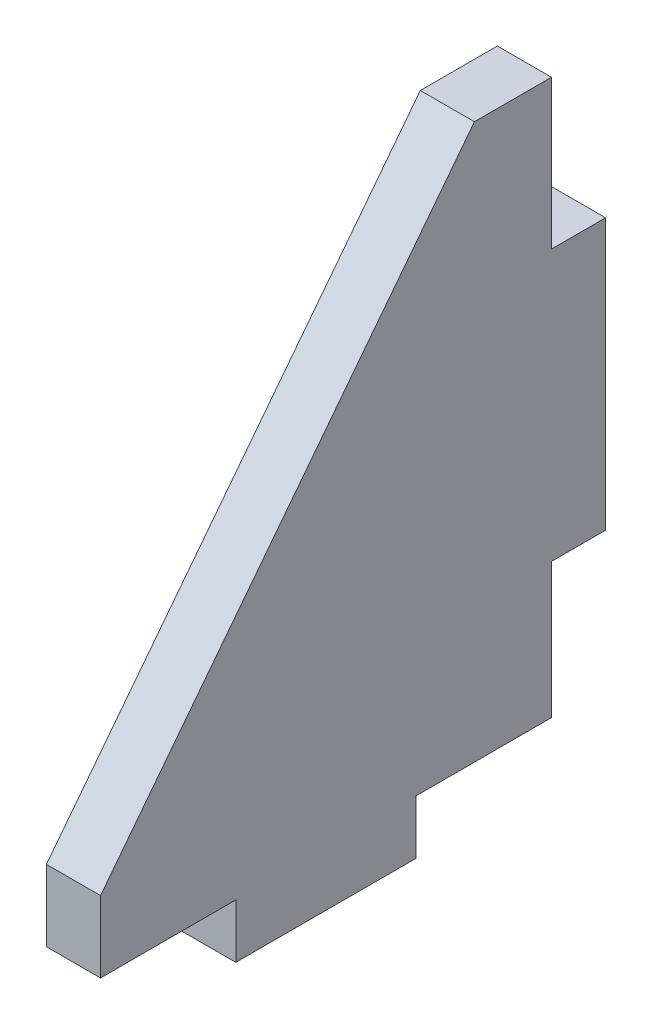
ISO-10303-21;
HEADER;
FILE_DESCRIPTION(('STEP AP214'),'2;1');
FILE_NAME('part.step','',(''),(''),'','','');
FILE_SCHEMA(('AUTOMOTIVE_DESIGN { 1 0 10303 214 1 1 1 1 }'));
ENDSEC;
DATA;
#1=APPLICATION_CONTEXT('core data for automotive mechanical design processes');
#2=APPLICATION_PROTOCOL_DEFINITION('international standard','automotive_design',2000,#1);
#3=PRODUCT_CONTEXT('',#1,'mechanical');
#4=PRODUCT('Part','Part','',(#3));
#5=PRODUCT_RELATED_PRODUCT_CATEGORY('part','',(#4));
#6=PRODUCT_DEFINITION_FORMATION('','',#4);
#7=PRODUCT_DEFINITION_CONTEXT('part definition',#1,'design');
#8=PRODUCT_DEFINITION('design','',#6,#7);
#9=PRODUCT_DEFINITION_SHAPE('','',#8);
#10=(LENGTH_UNIT() NAMED_UNIT(*) SI_UNIT(.MILLI.,.METRE.));
#11=(NAMED_UNIT(*) PLANE_ANGLE_UNIT() SI_UNIT($,.RADIAN.));
#12=(NAMED_UNIT(*) SI_UNIT($,.STERADIAN.) SOLID_ANGLE_UNIT());
#13=UNCERTAINTY_MEASURE_WITH_UNIT(LENGTH_MEASURE(1.E-05),#10,'distance_accuracy_value','');
#14=(GEOMETRIC_REPRESENTATION_CONTEXT(3) GLOBAL_UNCERTAINTY_ASSIGNED_CONTEXT((#13)) GLOBAL_UNIT_ASSIGNED_CONTEXT((#10,
#11,#12)) REPRESENTATION_CONTEXT('',''));
#15=CARTESIAN_POINT('',(0.,0.,0.));
#16=DIRECTION('',(0.,0.,1.));
#17=DIRECTION('',(1.,0.,0.));
#18=AXIS2_PLACEMENT_3D('',#15,#16,#17);
#19=CARTESIAN_POINT('',(0.,0.,0.));
#20=DIRECTION('',(0.,0.,1.));
#21=DIRECTION('',(1.,0.,0.));
#22=AXIS2_PLACEMENT_3D('',#19,#20,#21);
#23=PLANE('',#22);
#24=DIRECTION('',(1.,0.,0.));
#25=VECTOR('',#24,1.);
#26=CARTESIAN_POINT('',(0.,11.,0.));
#27=LINE('',#26,#25);
#28=CARTESIAN_POINT('',(0.,11.,0.));
#29=VERTEX_POINT('',#28);
#30=CARTESIAN_POINT('',(5.99999999999999,11.,0.));
#31=VERTEX_POINT('',#30);
#32=EDGE_CURVE('E202',#29,#31,#27,.T.);
#33=ORIENTED_EDGE('',*,*,#32,.F.);
#34=DIRECTION('',(0.,-1.,0.));
#35=VECTOR('',#34,1.);
#36=CARTESIAN_POINT('',(0.,0.,0.));
#37=LINE('',#36,#35);
#38=CARTESIAN_POINT('',(0.,27.4983223368587,0.));
#39=VERTEX_POINT('',#38);
#40=EDGE_CURVE('E175',#39,#29,#37,.T.);
#41=ORIENTED_EDGE('',*,*,#40,.F.);
#42=DIRECTION('',(1.,0.,0.));
#43=VECTOR('',#42,1.);
#44=CARTESIAN_POINT('',(0.,27.4983223368587,0.));
#45=LINE('',#44,#43);
#46=CARTESIAN_POINT('',(5.99999999999999,27.4983223368586,0.));
#47=VERTEX_POINT('',#46);
#48=EDGE_CURVE('E168',#39,#47,#45,.T.);
#49=ORIENTED_EDGE('',*,*,#48,.T.);
#50=DIRECTION('',(0.,-1.,0.));
#51=VECTOR('',#50,1.);
#52=CARTESIAN_POINT('',(5.99999999999999,0.,0.));
#53=LINE('',#52,#51);
#54=EDGE_CURVE('E159',#47,#31,#53,.T.);
#55=ORIENTED_EDGE('',*,*,#54,.T.);
#56=EDGE_LOOP('',(#33,#41,#49,#55));
#57=FACE_BOUND('',#56,.T.);
#58=ADVANCED_FACE('F45',(#57),#23,.F.);
#59=CARTESIAN_POINT('',(0.,0.,50.));
#60=DIRECTION('',(1.,0.,0.));
#61=DIRECTION('',(0.,0.,-1.));
#62=AXIS2_PLACEMENT_3D('',#59,#60,#61);
#63=PLANE('',#62);
#64=DIRECTION('',(0.,-1.,0.));
#65=VECTOR('',#64,1.);
#66=CARTESIAN_POINT('',(0.,0.,50.));
#67=LINE('',#66,#65);
#68=CARTESIAN_POINT('',(0.,-26.0858995726596,50.));
#69=VERTEX_POINT('',#68);
#70=CARTESIAN_POINT('',(0.,-34.,50.));
#71=VERTEX_POINT('',#70);
#72=EDGE_CURVE('E171',#69,#71,#67,.T.);
#73=ORIENTED_EDGE('',*,*,#72,.F.);
#74=DIRECTION('',(0.,-0.790917168706805,0.611923224142385));
#75=VECTOR('',#74,1.);
#76=CARTESIAN_POINT('',(0.,27.4983223368587,8.54252362779526));
#77=LINE('',#76,#75);
#78=CARTESIAN_POINT('',(0.,27.4983223368587,8.54252362779526));
#79=VERTEX_POINT('',#78);
#80=EDGE_CURVE('E61',#79,#69,#77,.T.);
#81=ORIENTED_EDGE('',*,*,#80,.F.);
#82=DIRECTION('',(0.,0.,-1.));
#83=VECTOR('',#82,1.);
#84=CARTESIAN_POINT('',(0.,27.4983223368587,50.));
#85=LINE('',#84,#83);
#86=EDGE_CURVE('E154',#79,#39,#85,.T.);
#87=ORIENTED_EDGE('',*,*,#86,.T.);
#88=ORIENTED_EDGE('',*,*,#40,.T.);
#89=DIRECTION('',(0.,0.,1.));
#90=VECTOR('',#89,1.);
#91=CARTESIAN_POINT('',(0.,11.,-6.));
#92=LINE('',#91,#90);
#93=CARTESIAN_POINT('',(0.,11.,-6.));
#94=VERTEX_POINT('',#93);
#95=EDGE_CURVE('E184',#94,#29,#92,.T.);
#96=ORIENTED_EDGE('',*,*,#95,.F.);
#97=DIRECTION('',(0.,-1.,0.));
#98=VECTOR('',#97,1.);
#99=CARTESIAN_POINT('',(0.,0.,-6.));
#100=LINE('',#99,#98);
#101=CARTESIAN_POINT('',(0.,-19.,-6.));
#102=VERTEX_POINT('',#101);
#103=EDGE_CURVE('E213',#94,#102,#100,.T.);
#104=ORIENTED_EDGE('',*,*,#103,.T.);
#105=DIRECTION('',(0.,0.,1.));
#106=VECTOR('',#105,1.);
#107=CARTESIAN_POINT('',(0.,-19.,-6.));
#108=LINE('',#107,#106);
#109=CARTESIAN_POINT('',(0.,-19.,0.));
#110=VERTEX_POINT('',#109);
#111=EDGE_CURVE('E187',#102,#110,#108,.T.);
#112=ORIENTED_EDGE('',*,*,#111,.T.);
#113=CARTESIAN_POINT('',(0.,-34.,0.));
#114=VERTEX_POINT('',#113);
#115=EDGE_CURVE('E179',#110,#114,#37,.T.);
#116=ORIENTED_EDGE('',*,*,#115,.T.);
#117=DIRECTION('',(0.,0.,-1.));
#118=VECTOR('',#117,1.);
#119=CARTESIAN_POINT('',(0.,-34.,0.));
#120=LINE('',#119,#118);
#121=CARTESIAN_POINT('',(0.,-34.,15.));
#122=VERTEX_POINT('',#121);
#123=EDGE_CURVE('E241',#122,#114,#120,.T.);
#124=ORIENTED_EDGE('',*,*,#123,.F.);
#125=DIRECTION('',(0.,1.,0.));
#126=VECTOR('',#125,1.);
#127=CARTESIAN_POINT('',(0.,-34.,15.));
#128=LINE('',#127,#126);
#129=CARTESIAN_POINT('',(0.,-40.,15.));
#130=VERTEX_POINT('',#129);
#131=EDGE_CURVE('E245',#130,#122,#128,.T.);
#132=ORIENTED_EDGE('',*,*,#131,.F.);
#133=DIRECTION('',(0.,0.,-1.));
#134=VECTOR('',#133,1.);
#135=CARTESIAN_POINT('',(0.,-40.,50.));
#136=LINE('',#135,#134);
#137=CARTESIAN_POINT('',(0.,-40.,35.));
#138=VERTEX_POINT('',#137);
#139=EDGE_CURVE('E11',#138,#130,#136,.T.);
#140=ORIENTED_EDGE('',*,*,#139,.F.);
#141=DIRECTION('',(0.,-1.,0.));
#142=VECTOR('',#141,1.);
#143=CARTESIAN_POINT('',(0.,-34.,35.));
#144=LINE('',#143,#142);
#145=CARTESIAN_POINT('',(0.,-34.,35.));
#146=VERTEX_POINT('',#145);
#147=EDGE_CURVE('E249',#146,#138,#144,.T.);
#148=ORIENTED_EDGE('',*,*,#147,.F.);
#149=DIRECTION('',(0.,0.,-1.));
#150=VECTOR('',#149,1.);
#151=CARTESIAN_POINT('',(0.,-34.,50.));
#152=LINE('',#151,#150);
#153=EDGE_CURVE('E252',#71,#146,#152,.T.);
#154=ORIENTED_EDGE('',*,*,#153,.F.);
#155=EDGE_LOOP('',(#73,#81,#87,#88,#96,#104,#112,#116,#124,#132,#140,#148,#154));
#156=FACE_BOUND('',#155,.T.);
#157=ADVANCED_FACE('F47',(#156),#63,.F.);
#158=CARTESIAN_POINT('',(0.,-40.,50.));
#159=DIRECTION('',(0.,1.,0.));
#160=DIRECTION('',(0.,0.,1.));
#161=AXIS2_PLACEMENT_3D('',#158,#159,#160);
#162=PLANE('',#161);
#163=ORIENTED_EDGE('',*,*,#139,.T.);
#164=DIRECTION('',(-1.,0.,0.));
#165=VECTOR('',#164,1.);
#166=CARTESIAN_POINT('',(6.,-40.,15.));
#167=LINE('',#166,#165);
#168=CARTESIAN_POINT('',(6.,-40.,15.));
#169=VERTEX_POINT('',#168);
#170=EDGE_CURVE('E232',#169,#130,#167,.T.);
#171=ORIENTED_EDGE('',*,*,#170,.F.);
#172=DIRECTION('',(0.,0.,-1.));
#173=VECTOR('',#172,1.);
#174=CARTESIAN_POINT('',(6.,-40.,50.));
#175=LINE('',#174,#173);
#176=CARTESIAN_POINT('',(6.,-40.,35.));
#177=VERTEX_POINT('',#176);
#178=EDGE_CURVE('E54',#177,#169,#175,.T.);
#179=ORIENTED_EDGE('',*,*,#178,.F.);
#180=DIRECTION('',(-1.,0.,0.));
#181=VECTOR('',#180,1.);
#182=CARTESIAN_POINT('',(6.,-40.,35.));
#183=LINE('',#182,#181);
#184=EDGE_CURVE('E228',#177,#138,#183,.T.);
#185=ORIENTED_EDGE('',*,*,#184,.T.);
#186=EDGE_LOOP('',(#163,#171,#179,#185));
#187=FACE_BOUND('',#186,.T.);
#188=ADVANCED_FACE('F315',(#187),#162,.F.);
#189=CARTESIAN_POINT('',(5.99999999999999,0.,50.));
#190=DIRECTION('',(1.,0.,0.));
#191=DIRECTION('',(0.,1.,0.));
#192=AXIS2_PLACEMENT_3D('',#189,#190,#191);
#193=PLANE('',#192);
#194=DIRECTION('',(0.,-0.790917168706805,0.611923224142385));
#195=VECTOR('',#194,1.);
#196=CARTESIAN_POINT('',(6.,27.4983223368587,8.54252362779526));
#197=LINE('',#196,#195);
#198=CARTESIAN_POINT('',(6.,27.4983223368587,8.54252362779526));
#199=VERTEX_POINT('',#198);
#200=CARTESIAN_POINT('',(6.,-26.0858995726596,50.));
#201=VERTEX_POINT('',#200);
#202=EDGE_CURVE('E140',#199,#201,#197,.T.);
#203=ORIENTED_EDGE('',*,*,#202,.T.);
#204=DIRECTION('',(0.,-1.,0.));
#205=VECTOR('',#204,1.);
#206=CARTESIAN_POINT('',(5.99999999999999,0.,50.));
#207=LINE('',#206,#205);
#208=CARTESIAN_POINT('',(6.,-34.,50.));
#209=VERTEX_POINT('',#208);
#210=EDGE_CURVE('E69',#201,#209,#207,.T.);
#211=ORIENTED_EDGE('',*,*,#210,.T.);
#212=DIRECTION('',(0.,0.,-1.));
#213=VECTOR('',#212,1.);
#214=CARTESIAN_POINT('',(6.,-34.,50.));
#215=LINE('',#214,#213);
#216=CARTESIAN_POINT('',(6.,-34.,35.));
#217=VERTEX_POINT('',#216);
#218=EDGE_CURVE('E244',#209,#217,#215,.T.);
#219=ORIENTED_EDGE('',*,*,#218,.T.);
#220=DIRECTION('',(0.,-1.,0.));
#221=VECTOR('',#220,1.);
#222=CARTESIAN_POINT('',(6.,-34.,35.));
#223=LINE('',#222,#221);
#224=EDGE_CURVE('E263',#217,#177,#223,.T.);
#225=ORIENTED_EDGE('',*,*,#224,.T.);
#226=ORIENTED_EDGE('',*,*,#178,.T.);
#227=DIRECTION('',(0.,1.,0.));
#228=VECTOR('',#227,1.);
#229=CARTESIAN_POINT('',(6.,-34.,15.));
#230=LINE('',#229,#228);
#231=CARTESIAN_POINT('',(6.,-34.,15.));
#232=VERTEX_POINT('',#231);
#233=EDGE_CURVE('E259',#169,#232,#230,.T.);
#234=ORIENTED_EDGE('',*,*,#233,.T.);
#235=DIRECTION('',(0.,0.,-1.));
#236=VECTOR('',#235,1.);
#237=CARTESIAN_POINT('',(6.,-34.,0.));
#238=LINE('',#237,#236);
#239=CARTESIAN_POINT('',(6.,-34.,0.));
#240=VERTEX_POINT('',#239);
#241=EDGE_CURVE('E225',#232,#240,#238,.T.);
#242=ORIENTED_EDGE('',*,*,#241,.T.);
#243=CARTESIAN_POINT('',(6.,-19.,0.));
#244=VERTEX_POINT('',#243);
#245=EDGE_CURVE('E174',#244,#240,#53,.T.);
#246=ORIENTED_EDGE('',*,*,#245,.F.);
#247=DIRECTION('',(0.,0.,1.));
#248=VECTOR('',#247,1.);
#249=CARTESIAN_POINT('',(6.,-19.,-6.));
#250=LINE('',#249,#248);
#251=CARTESIAN_POINT('',(6.,-19.,-6.));
#252=VERTEX_POINT('',#251);
#253=EDGE_CURVE('E191',#252,#244,#250,.T.);
#254=ORIENTED_EDGE('',*,*,#253,.F.);
#255=DIRECTION('',(0.,-1.,0.));
#256=VECTOR('',#255,1.);
#257=CARTESIAN_POINT('',(5.99999999999999,0.,-6.));
#258=LINE('',#257,#256);
#259=CARTESIAN_POINT('',(5.99999999999999,11.,-6.));
#260=VERTEX_POINT('',#259);
#261=EDGE_CURVE('E188',#260,#252,#258,.T.);
#262=ORIENTED_EDGE('',*,*,#261,.F.);
#263=DIRECTION('',(0.,0.,1.));
#264=VECTOR('',#263,1.);
#265=CARTESIAN_POINT('',(5.99999999999999,11.,-6.));
#266=LINE('',#265,#264);
#267=EDGE_CURVE('E194',#260,#31,#266,.T.);
#268=ORIENTED_EDGE('',*,*,#267,.T.);
#269=ORIENTED_EDGE('',*,*,#54,.F.);
#270=DIRECTION('',(0.,0.,-1.));
#271=VECTOR('',#270,1.);
#272=CARTESIAN_POINT('',(5.99999999999999,27.4983223368586,50.));
#273=LINE('',#272,#271);
#274=EDGE_CURVE('E152',#199,#47,#273,.T.);
#275=ORIENTED_EDGE('',*,*,#274,.F.);
#276=EDGE_LOOP('',(#203,#211,#219,#225,#226,#234,#242,#246,#254,#262,#268,#269,#275));
#277=FACE_BOUND('',#276,.T.);
#278=ADVANCED_FACE('F157',(#277),#193,.T.);
#279=CARTESIAN_POINT('',(0.,27.4983223368587,50.));
#280=DIRECTION('',(0.,1.,0.));
#281=DIRECTION('',(-1.,0.,0.));
#282=AXIS2_PLACEMENT_3D('',#279,#280,#281);
#283=PLANE('',#282);
#284=DIRECTION('',(-1.,0.,0.));
#285=VECTOR('',#284,1.);
#286=CARTESIAN_POINT('',(6.,27.4983223368587,8.54252362779526));
#287=LINE('',#286,#285);
#288=EDGE_CURVE('E143',#199,#79,#287,.T.);
#289=ORIENTED_EDGE('',*,*,#288,.F.);
#290=ORIENTED_EDGE('',*,*,#274,.T.);
#291=ORIENTED_EDGE('',*,*,#48,.F.);
#292=ORIENTED_EDGE('',*,*,#86,.F.);
#293=EDGE_LOOP('',(#289,#290,#291,#292));
#294=FACE_BOUND('',#293,.T.);
#295=ADVANCED_FACE('F150',(#294),#283,.T.);
#296=CARTESIAN_POINT('',(0.,0.,50.));
#297=DIRECTION('',(0.,0.,1.));
#298=DIRECTION('',(1.,0.,0.));
#299=AXIS2_PLACEMENT_3D('',#296,#297,#298);
#300=PLANE('',#299);
#301=DIRECTION('',(-1.,0.,0.));
#302=VECTOR('',#301,1.);
#303=CARTESIAN_POINT('',(6.,-26.0858995726596,50.));
#304=LINE('',#303,#302);
#305=EDGE_CURVE('E144',#201,#69,#304,.T.);
#306=ORIENTED_EDGE('',*,*,#305,.T.);
#307=ORIENTED_EDGE('',*,*,#72,.T.);
#308=DIRECTION('',(-1.,0.,0.));
#309=VECTOR('',#308,1.);
#310=CARTESIAN_POINT('',(6.,-34.,50.));
#311=LINE('',#310,#309);
#312=EDGE_CURVE('E220',#209,#71,#311,.T.);
#313=ORIENTED_EDGE('',*,*,#312,.F.);
#314=ORIENTED_EDGE('',*,*,#210,.F.);
#315=EDGE_LOOP('',(#306,#307,#313,#314));
#316=FACE_BOUND('',#315,.T.);
#317=ADVANCED_FACE('F307',(#316),#300,.T.);
#318=ORIENTED_EDGE('',*,*,#245,.T.);
#319=DIRECTION('',(-1.,0.,0.));
#320=VECTOR('',#319,1.);
#321=CARTESIAN_POINT('',(6.,-34.,0.));
#322=LINE('',#321,#320);
#323=EDGE_CURVE('E206',#240,#114,#322,.T.);
#324=ORIENTED_EDGE('',*,*,#323,.T.);
#325=ORIENTED_EDGE('',*,*,#115,.F.);
#326=DIRECTION('',(1.,0.,0.));
#327=VECTOR('',#326,1.);
#328=CARTESIAN_POINT('',(0.,-19.,0.));
#329=LINE('',#328,#327);
#330=EDGE_CURVE('E197',#110,#244,#329,.T.);
#331=ORIENTED_EDGE('',*,*,#330,.T.);
#332=EDGE_LOOP('',(#318,#324,#325,#331));
#333=FACE_BOUND('',#332,.T.);
#334=ADVANCED_FACE('F278',(#333),#23,.F.);
#335=CARTESIAN_POINT('',(0.,11.,-6.));
#336=DIRECTION('',(0.,-1.,0.));
#337=DIRECTION('',(0.,0.,-1.));
#338=AXIS2_PLACEMENT_3D('',#335,#336,#337);
#339=PLANE('',#338);
#340=ORIENTED_EDGE('',*,*,#32,.T.);
#341=ORIENTED_EDGE('',*,*,#267,.F.);
#342=DIRECTION('',(1.,0.,0.));
#343=VECTOR('',#342,1.);
#344=CARTESIAN_POINT('',(0.,11.,-6.));
#345=LINE('',#344,#343);
#346=EDGE_CURVE('E201',#94,#260,#345,.T.);
#347=ORIENTED_EDGE('',*,*,#346,.F.);
#348=ORIENTED_EDGE('',*,*,#95,.T.);
#349=EDGE_LOOP('',(#340,#341,#347,#348));
#350=FACE_BOUND('',#349,.T.);
#351=ADVANCED_FACE('F300',(#350),#339,.F.);
#352=CARTESIAN_POINT('',(0.,-19.,-6.));
#353=DIRECTION('',(0.,-1.,0.));
#354=DIRECTION('',(0.,0.,-1.));
#355=AXIS2_PLACEMENT_3D('',#352,#353,#354);
#356=PLANE('',#355);
#357=ORIENTED_EDGE('',*,*,#330,.F.);
#358=ORIENTED_EDGE('',*,*,#111,.F.);
#359=DIRECTION('',(1.,0.,0.));
#360=VECTOR('',#359,1.);
#361=CARTESIAN_POINT('',(0.,-19.,-6.));
#362=LINE('',#361,#360);
#363=EDGE_CURVE('E209',#102,#252,#362,.T.);
#364=ORIENTED_EDGE('',*,*,#363,.T.);
#365=ORIENTED_EDGE('',*,*,#253,.T.);
#366=EDGE_LOOP('',(#357,#358,#364,#365));
#367=FACE_BOUND('',#366,.T.);
#368=ADVANCED_FACE('F293',(#367),#356,.T.);
#369=CARTESIAN_POINT('',(0.,0.,-6.));
#370=DIRECTION('',(0.,0.,1.));
#371=DIRECTION('',(1.,0.,0.));
#372=AXIS2_PLACEMENT_3D('',#369,#370,#371);
#373=PLANE('',#372);
#374=ORIENTED_EDGE('',*,*,#346,.T.);
#375=ORIENTED_EDGE('',*,*,#261,.T.);
#376=ORIENTED_EDGE('',*,*,#363,.F.);
#377=ORIENTED_EDGE('',*,*,#103,.F.);
#378=EDGE_LOOP('',(#374,#375,#376,#377));
#379=FACE_BOUND('',#378,.T.);
#380=ADVANCED_FACE('F295',(#379),#373,.F.);
#381=CARTESIAN_POINT('',(6.,-34.,0.));
#382=DIRECTION('',(0.,1.,0.));
#383=DIRECTION('',(0.,0.,1.));
#384=AXIS2_PLACEMENT_3D('',#381,#382,#383);
#385=PLANE('',#384);
#386=ORIENTED_EDGE('',*,*,#123,.T.);
#387=ORIENTED_EDGE('',*,*,#323,.F.);
#388=ORIENTED_EDGE('',*,*,#241,.F.);
#389=DIRECTION('',(-1.,0.,0.));
#390=VECTOR('',#389,1.);
#391=CARTESIAN_POINT('',(6.,-34.,15.));
#392=LINE('',#391,#390);
#393=EDGE_CURVE('E235',#232,#122,#392,.T.);
#394=ORIENTED_EDGE('',*,*,#393,.T.);
#395=EDGE_LOOP('',(#386,#387,#388,#394));
#396=FACE_BOUND('',#395,.T.);
#397=ADVANCED_FACE('F284',(#396),#385,.F.);
#398=CARTESIAN_POINT('',(6.,-34.,15.));
#399=DIRECTION('',(0.,0.,1.));
#400=DIRECTION('',(1.,0.,0.));
#401=AXIS2_PLACEMENT_3D('',#398,#399,#400);
#402=PLANE('',#401);
#403=ORIENTED_EDGE('',*,*,#131,.T.);
#404=ORIENTED_EDGE('',*,*,#393,.F.);
#405=ORIENTED_EDGE('',*,*,#233,.F.);
#406=ORIENTED_EDGE('',*,*,#170,.T.);
#407=EDGE_LOOP('',(#403,#404,#405,#406));
#408=FACE_BOUND('',#407,.T.);
#409=ADVANCED_FACE('F317',(#408),#402,.F.);
#410=CARTESIAN_POINT('',(6.,-34.,35.));
#411=DIRECTION('',(0.,0.,-1.));
#412=DIRECTION('',(-1.,0.,0.));
#413=AXIS2_PLACEMENT_3D('',#410,#411,#412);
#414=PLANE('',#413);
#415=ORIENTED_EDGE('',*,*,#147,.T.);
#416=ORIENTED_EDGE('',*,*,#184,.F.);
#417=ORIENTED_EDGE('',*,*,#224,.F.);
#418=DIRECTION('',(-1.,0.,0.));
#419=VECTOR('',#418,1.);
#420=CARTESIAN_POINT('',(6.,-34.,35.));
#421=LINE('',#420,#419);
#422=EDGE_CURVE('E224',#217,#146,#421,.T.);
#423=ORIENTED_EDGE('',*,*,#422,.T.);
#424=EDGE_LOOP('',(#415,#416,#417,#423));
#425=FACE_BOUND('',#424,.T.);
#426=ADVANCED_FACE('F319',(#425),#414,.F.);
#427=CARTESIAN_POINT('',(6.,-34.,50.));
#428=DIRECTION('',(0.,1.,0.));
#429=DIRECTION('',(0.,0.,1.));
#430=AXIS2_PLACEMENT_3D('',#427,#428,#429);
#431=PLANE('',#430);
#432=ORIENTED_EDGE('',*,*,#153,.T.);
#433=ORIENTED_EDGE('',*,*,#422,.F.);
#434=ORIENTED_EDGE('',*,*,#218,.F.);
#435=ORIENTED_EDGE('',*,*,#312,.T.);
#436=EDGE_LOOP('',(#432,#433,#434,#435));
#437=FACE_BOUND('',#436,.T.);
#438=ADVANCED_FACE('F309',(#437),#431,.F.);
#439=CARTESIAN_POINT('',(6.,27.4983223368587,8.54252362779526));
#440=DIRECTION('',(0.,-0.611923224142385,-0.790917168706805));
#441=DIRECTION('',(0.,0.790917168706805,-0.611923224142385));
#442=AXIS2_PLACEMENT_3D('',#439,#440,#441);
#443=PLANE('',#442);
#444=ORIENTED_EDGE('',*,*,#80,.T.);
#445=ORIENTED_EDGE('',*,*,#305,.F.);
#446=ORIENTED_EDGE('',*,*,#202,.F.);
#447=ORIENTED_EDGE('',*,*,#288,.T.);
#448=EDGE_LOOP('',(#444,#445,#446,#447));
#449=FACE_BOUND('',#448,.T.);
#450=ADVANCED_FACE('F142',(#449),#443,.F.);
#451=CLOSED_SHELL('',(#58,#157,#188,#278,#295,#317,#334,#351,#368,#380,#397,#409,#426,#438,#450));
#452=MANIFOLD_SOLID_BREP('B2',#451);
#453=ADVANCED_BREP_SHAPE_REPRESENTATION('',(#18,#452),#14);
#454=SHAPE_DEFINITION_REPRESENTATION(#9,#453);
ENDSEC;
END-ISO-10303-21;
